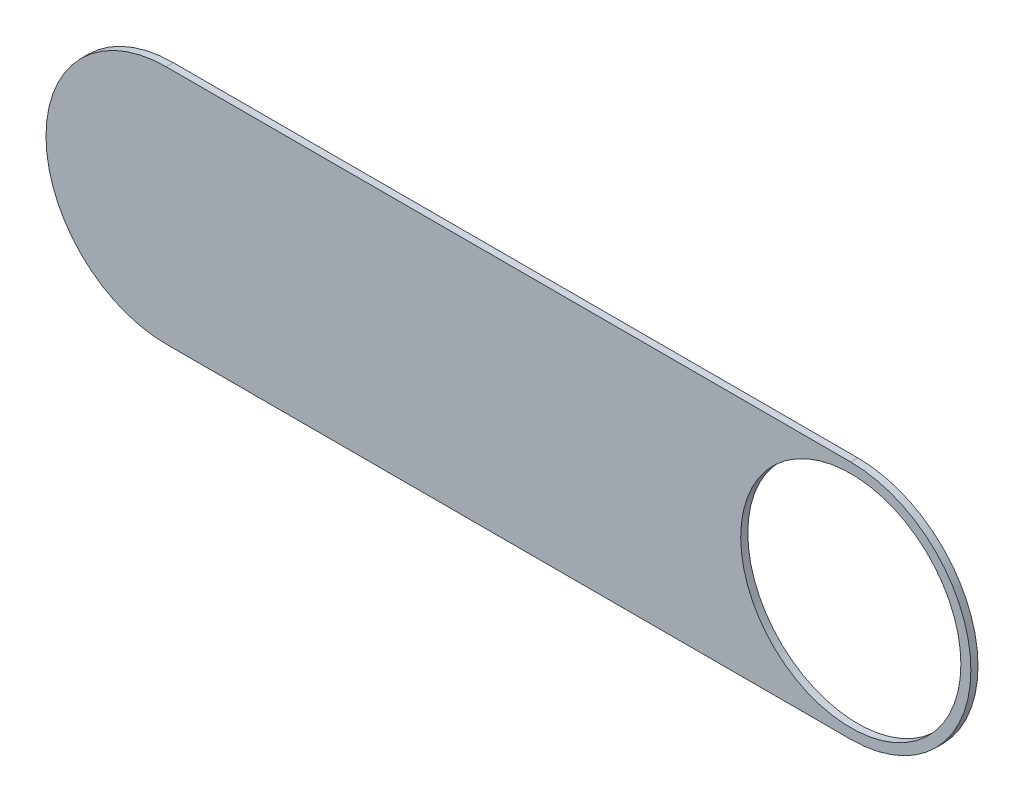
ISO-10303-21;
HEADER;
FILE_DESCRIPTION(('STEP AP214'),'2;1');
FILE_NAME('part.step','',(''),(''),'','','');
FILE_SCHEMA(('AUTOMOTIVE_DESIGN { 1 0 10303 214 1 1 1 1 }'));
ENDSEC;
DATA;
#1=APPLICATION_CONTEXT('core data for automotive mechanical design processes');
#2=APPLICATION_PROTOCOL_DEFINITION('international standard','automotive_design',2000,#1);
#3=PRODUCT_CONTEXT('',#1,'mechanical');
#4=PRODUCT('Part','Part','',(#3));
#5=PRODUCT_RELATED_PRODUCT_CATEGORY('part','',(#4));
#6=PRODUCT_DEFINITION_FORMATION('','',#4);
#7=PRODUCT_DEFINITION_CONTEXT('part definition',#1,'design');
#8=PRODUCT_DEFINITION('design','',#6,#7);
#9=PRODUCT_DEFINITION_SHAPE('','',#8);
#10=(LENGTH_UNIT() NAMED_UNIT(*) SI_UNIT(.MILLI.,.METRE.));
#11=(NAMED_UNIT(*) PLANE_ANGLE_UNIT() SI_UNIT($,.RADIAN.));
#12=(NAMED_UNIT(*) SI_UNIT($,.STERADIAN.) SOLID_ANGLE_UNIT());
#13=UNCERTAINTY_MEASURE_WITH_UNIT(LENGTH_MEASURE(1.E-05),#10,'distance_accuracy_value','');
#14=(GEOMETRIC_REPRESENTATION_CONTEXT(3) GLOBAL_UNCERTAINTY_ASSIGNED_CONTEXT((#13)) GLOBAL_UNIT_ASSIGNED_CONTEXT((#10,
#11,#12)) REPRESENTATION_CONTEXT('',''));
#15=CARTESIAN_POINT('',(0.,0.,0.));
#16=DIRECTION('',(0.,0.,1.));
#17=DIRECTION('',(1.,0.,0.));
#18=AXIS2_PLACEMENT_3D('',#15,#16,#17);
#19=CARTESIAN_POINT('',(82.3214,70.030848,0.));
#20=DIRECTION('',(0.,1.,0.));
#21=DIRECTION('',(1.,0.,0.));
#22=AXIS2_PLACEMENT_3D('',#19,#20,#21);
#23=PLANE('',#22);
#24=DIRECTION('',(1.,0.,0.));
#25=VECTOR('',#24,1.);
#26=CARTESIAN_POINT('',(82.3214,70.030848,0.03556));
#27=LINE('',#26,#25);
#28=CARTESIAN_POINT('',(82.3214,70.030848,0.03556));
#29=VERTEX_POINT('',#28);
#30=CARTESIAN_POINT('',(85.742018,70.030848,0.03556));
#31=VERTEX_POINT('',#30);
#32=EDGE_CURVE('E11',#29,#31,#27,.T.);
#33=ORIENTED_EDGE('',*,*,#32,.F.);
#34=DIRECTION('',(0.,0.,1.));
#35=VECTOR('',#34,1.);
#36=CARTESIAN_POINT('',(82.3214,70.030848,0.));
#37=LINE('',#36,#35);
#38=CARTESIAN_POINT('',(82.3214,70.030848,0.));
#39=VERTEX_POINT('',#38);
#40=EDGE_CURVE('E24',#39,#29,#37,.T.);
#41=ORIENTED_EDGE('',*,*,#40,.F.);
#42=DIRECTION('',(1.,0.,0.));
#43=VECTOR('',#42,1.);
#44=CARTESIAN_POINT('',(82.3214,70.030848,0.));
#45=LINE('',#44,#43);
#46=CARTESIAN_POINT('',(85.742018,70.030848,0.));
#47=VERTEX_POINT('',#46);
#48=EDGE_CURVE('E96',#39,#47,#45,.T.);
#49=ORIENTED_EDGE('',*,*,#48,.T.);
#50=DIRECTION('',(0.,0.,1.));
#51=VECTOR('',#50,1.);
#52=CARTESIAN_POINT('',(85.742018,70.030848,0.));
#53=LINE('',#52,#51);
#54=EDGE_CURVE('E37',#47,#31,#53,.T.);
#55=ORIENTED_EDGE('',*,*,#54,.T.);
#56=EDGE_LOOP('',(#33,#41,#49,#55));
#57=FACE_BOUND('',#56,.T.);
#58=ADVANCED_FACE('F17',(#57),#23,.F.);
#59=CARTESIAN_POINT('',(82.3214,70.6308468,0.));
#60=DIRECTION('',(0.,0.,-1.));
#61=DIRECTION('',(0.,1.,0.));
#62=AXIS2_PLACEMENT_3D('',#59,#60,#61);
#63=CYLINDRICAL_SURFACE('',#62,0.599998799999999);
#64=CARTESIAN_POINT('',(82.3214,70.6308468,0.03556));
#65=DIRECTION('',(0.,0.,1.));
#66=DIRECTION('',(0.,1.,0.));
#67=AXIS2_PLACEMENT_3D('',#64,#65,#66);
#68=CIRCLE('',#67,0.599998799999999);
#69=CARTESIAN_POINT('',(82.3214,71.2308456,0.03556));
#70=VERTEX_POINT('',#69);
#71=EDGE_CURVE('E92',#70,#29,#68,.T.);
#72=ORIENTED_EDGE('',*,*,#71,.F.);
#73=DIRECTION('',(0.,0.,1.));
#74=VECTOR('',#73,1.);
#75=CARTESIAN_POINT('',(82.3214,71.2308456,0.));
#76=LINE('',#75,#74);
#77=CARTESIAN_POINT('',(82.3214,71.2308456,0.));
#78=VERTEX_POINT('',#77);
#79=EDGE_CURVE('E90',#78,#70,#76,.T.);
#80=ORIENTED_EDGE('',*,*,#79,.F.);
#81=CARTESIAN_POINT('',(82.3214,70.6308468,0.));
#82=DIRECTION('',(0.,0.,1.));
#83=DIRECTION('',(0.,1.,0.));
#84=AXIS2_PLACEMENT_3D('',#81,#82,#83);
#85=CIRCLE('',#84,0.599998799999999);
#86=EDGE_CURVE('E88',#78,#39,#85,.T.);
#87=ORIENTED_EDGE('',*,*,#86,.T.);
#88=ORIENTED_EDGE('',*,*,#40,.T.);
#89=EDGE_LOOP('',(#72,#80,#87,#88));
#90=FACE_BOUND('',#89,.T.);
#91=ADVANCED_FACE('F111',(#90),#63,.T.);
#92=CARTESIAN_POINT('',(85.742018,70.6308468,0.));
#93=DIRECTION('',(0.,0.,-1.));
#94=DIRECTION('',(0.,-1.,0.));
#95=AXIS2_PLACEMENT_3D('',#92,#93,#94);
#96=CYLINDRICAL_SURFACE('',#95,0.599998799999999);
#97=CARTESIAN_POINT('',(85.742018,70.6308468,0.03556));
#98=DIRECTION('',(0.,0.,1.));
#99=DIRECTION('',(0.,-1.,0.));
#100=AXIS2_PLACEMENT_3D('',#97,#98,#99);
#101=CIRCLE('',#100,0.599998799999999);
#102=CARTESIAN_POINT('',(85.742018,71.2308456,0.03556));
#103=VERTEX_POINT('',#102);
#104=EDGE_CURVE('E85',#31,#103,#101,.T.);
#105=ORIENTED_EDGE('',*,*,#104,.F.);
#106=ORIENTED_EDGE('',*,*,#54,.F.);
#107=CARTESIAN_POINT('',(85.742018,70.6308468,0.));
#108=DIRECTION('',(0.,0.,1.));
#109=DIRECTION('',(0.,-1.,0.));
#110=AXIS2_PLACEMENT_3D('',#107,#108,#109);
#111=CIRCLE('',#110,0.599998799999999);
#112=CARTESIAN_POINT('',(85.742018,71.2308456,0.));
#113=VERTEX_POINT('',#112);
#114=EDGE_CURVE('E82',#47,#113,#111,.T.);
#115=ORIENTED_EDGE('',*,*,#114,.T.);
#116=DIRECTION('',(0.,0.,1.));
#117=VECTOR('',#116,1.);
#118=CARTESIAN_POINT('',(85.742018,71.2308456,0.));
#119=LINE('',#118,#117);
#120=EDGE_CURVE('E80',#113,#103,#119,.T.);
#121=ORIENTED_EDGE('',*,*,#120,.T.);
#122=EDGE_LOOP('',(#105,#106,#115,#121));
#123=FACE_BOUND('',#122,.T.);
#124=ADVANCED_FACE('F104',(#123),#96,.T.);
#125=CARTESIAN_POINT('',(85.742018,71.2308456,0.));
#126=DIRECTION('',(0.,-1.,0.));
#127=DIRECTION('',(-1.,0.,0.));
#128=AXIS2_PLACEMENT_3D('',#125,#126,#127);
#129=PLANE('',#128);
#130=DIRECTION('',(-1.,0.,0.));
#131=VECTOR('',#130,1.);
#132=CARTESIAN_POINT('',(85.742018,71.2308456,0.03556));
#133=LINE('',#132,#131);
#134=EDGE_CURVE('E77',#103,#70,#133,.T.);
#135=ORIENTED_EDGE('',*,*,#134,.F.);
#136=ORIENTED_EDGE('',*,*,#120,.F.);
#137=DIRECTION('',(-1.,0.,0.));
#138=VECTOR('',#137,1.);
#139=CARTESIAN_POINT('',(85.742018,71.2308456,0.));
#140=LINE('',#139,#138);
#141=EDGE_CURVE('E68',#113,#78,#140,.T.);
#142=ORIENTED_EDGE('',*,*,#141,.T.);
#143=ORIENTED_EDGE('',*,*,#79,.T.);
#144=EDGE_LOOP('',(#135,#136,#142,#143));
#145=FACE_BOUND('',#144,.T.);
#146=ADVANCED_FACE('F110',(#145),#129,.F.);
#147=CARTESIAN_POINT('',(85.742018,70.6308468,0.));
#148=DIRECTION('',(0.,0.,-1.));
#149=DIRECTION('',(1.,0.,0.));
#150=AXIS2_PLACEMENT_3D('',#147,#148,#149);
#151=CYLINDRICAL_SURFACE('',#150,0.5499989);
#152=DIRECTION('',(0.,0.,1.));
#153=VECTOR('',#152,1.);
#154=CARTESIAN_POINT('',(86.2920169,70.6308468,0.));
#155=LINE('',#154,#153);
#156=CARTESIAN_POINT('',(86.2920169,70.6308468,0.));
#157=VERTEX_POINT('',#156);
#158=CARTESIAN_POINT('',(86.2920169,70.6308468,0.03556));
#159=VERTEX_POINT('',#158);
#160=EDGE_CURVE('E62',#157,#159,#155,.T.);
#161=ORIENTED_EDGE('',*,*,#160,.T.);
#162=CARTESIAN_POINT('',(85.742018,70.6308468,0.03556));
#163=DIRECTION('',(0.,0.,1.));
#164=DIRECTION('',(1.,0.,0.));
#165=AXIS2_PLACEMENT_3D('',#162,#163,#164);
#166=CIRCLE('',#165,0.5499989);
#167=EDGE_CURVE('E67',#159,#159,#166,.T.);
#168=ORIENTED_EDGE('',*,*,#167,.T.);
#169=ORIENTED_EDGE('',*,*,#160,.F.);
#170=CARTESIAN_POINT('',(85.742018,70.6308468,0.));
#171=DIRECTION('',(0.,0.,1.));
#172=DIRECTION('',(1.,0.,0.));
#173=AXIS2_PLACEMENT_3D('',#170,#171,#172);
#174=CIRCLE('',#173,0.5499989);
#175=EDGE_CURVE('E65',#157,#157,#174,.T.);
#176=ORIENTED_EDGE('',*,*,#175,.F.);
#177=EDGE_LOOP('',(#161,#168,#169,#176));
#178=FACE_BOUND('',#177,.T.);
#179=ADVANCED_FACE('F64',(#178),#151,.F.);
#180=CARTESIAN_POINT('',(82.3214,70.030848,0.));
#181=DIRECTION('',(0.,0.,-1.));
#182=DIRECTION('',(-1.,0.,0.));
#183=AXIS2_PLACEMENT_3D('',#180,#181,#182);
#184=PLANE('',#183);
#185=ORIENTED_EDGE('',*,*,#48,.F.);
#186=ORIENTED_EDGE('',*,*,#86,.F.);
#187=ORIENTED_EDGE('',*,*,#141,.F.);
#188=ORIENTED_EDGE('',*,*,#114,.F.);
#189=EDGE_LOOP('',(#185,#186,#187,#188));
#190=FACE_BOUND('',#189,.T.);
#191=ORIENTED_EDGE('',*,*,#175,.T.);
#192=EDGE_LOOP('',(#191));
#193=FACE_BOUND('',#192,.T.);
#194=ADVANCED_FACE('F71',(#190,#193),#184,.T.);
#195=CARTESIAN_POINT('',(82.3214,70.030848,0.03556));
#196=DIRECTION('',(0.,0.,-1.));
#197=DIRECTION('',(-1.,0.,0.));
#198=AXIS2_PLACEMENT_3D('',#195,#196,#197);
#199=PLANE('',#198);
#200=ORIENTED_EDGE('',*,*,#134,.T.);
#201=ORIENTED_EDGE('',*,*,#71,.T.);
#202=ORIENTED_EDGE('',*,*,#32,.T.);
#203=ORIENTED_EDGE('',*,*,#104,.T.);
#204=EDGE_LOOP('',(#200,#201,#202,#203));
#205=FACE_BOUND('',#204,.T.);
#206=ORIENTED_EDGE('',*,*,#167,.F.);
#207=EDGE_LOOP('',(#206));
#208=FACE_BOUND('',#207,.T.);
#209=ADVANCED_FACE('F107',(#205,#208),#199,.F.);
#210=CLOSED_SHELL('',(#58,#91,#124,#146,#179,#194,#209));
#211=MANIFOLD_SOLID_BREP('B1',#210);
#212=ADVANCED_BREP_SHAPE_REPRESENTATION('',(#18,#211),#14);
#213=SHAPE_DEFINITION_REPRESENTATION(#9,#212);
ENDSEC;
END-ISO-10303-21;
